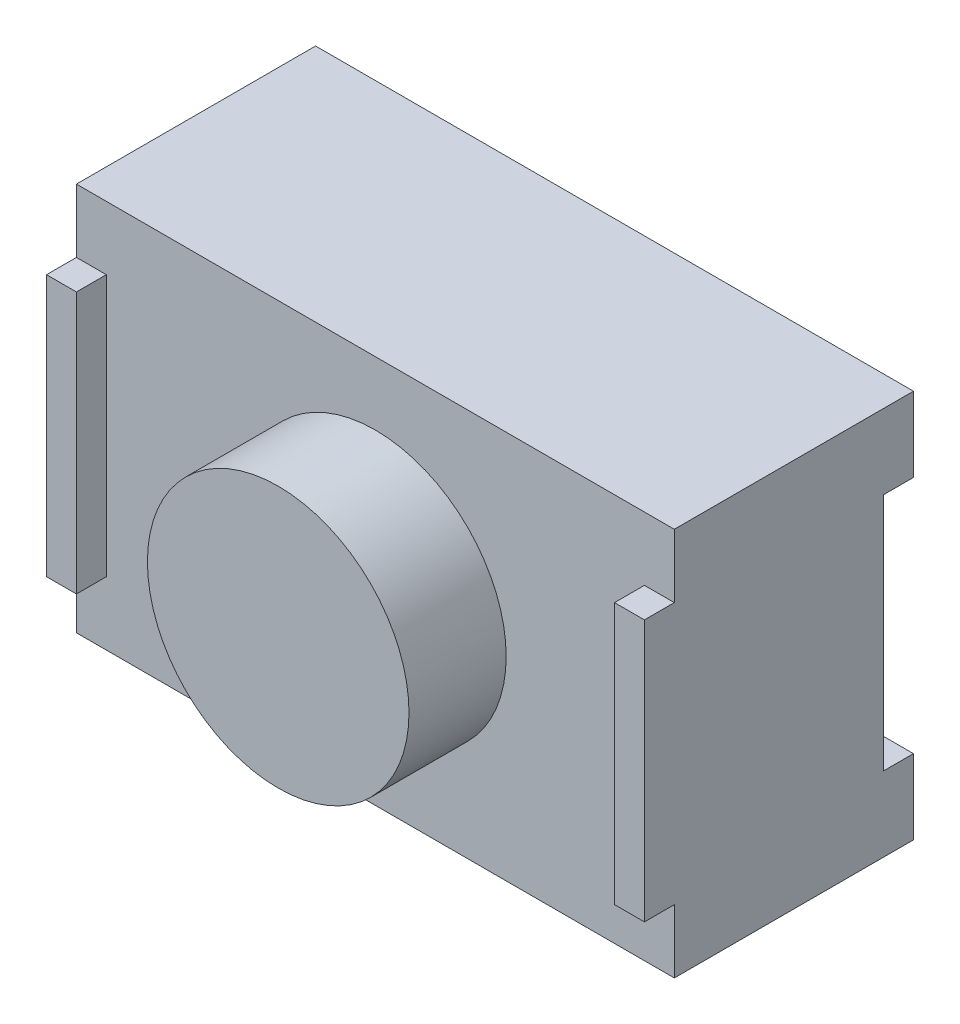
ISO-10303-21;
HEADER;
FILE_DESCRIPTION(('STEP AP214'),'2;1');
FILE_NAME('part.step','',(''),(''),'','','');
FILE_SCHEMA(('AUTOMOTIVE_DESIGN { 1 0 10303 214 1 1 1 1 }'));
ENDSEC;
DATA;
#1=APPLICATION_CONTEXT('core data for automotive mechanical design processes');
#2=APPLICATION_PROTOCOL_DEFINITION('international standard','automotive_design',2000,#1);
#3=PRODUCT_CONTEXT('',#1,'mechanical');
#4=PRODUCT('Part','Part','',(#3));
#5=PRODUCT_RELATED_PRODUCT_CATEGORY('part','',(#4));
#6=PRODUCT_DEFINITION_FORMATION('','',#4);
#7=PRODUCT_DEFINITION_CONTEXT('part definition',#1,'design');
#8=PRODUCT_DEFINITION('design','',#6,#7);
#9=PRODUCT_DEFINITION_SHAPE('','',#8);
#10=(LENGTH_UNIT() NAMED_UNIT(*) SI_UNIT(.MILLI.,.METRE.));
#11=(NAMED_UNIT(*) PLANE_ANGLE_UNIT() SI_UNIT($,.RADIAN.));
#12=(NAMED_UNIT(*) SI_UNIT($,.STERADIAN.) SOLID_ANGLE_UNIT());
#13=UNCERTAINTY_MEASURE_WITH_UNIT(LENGTH_MEASURE(1.E-05),#10,'distance_accuracy_value','');
#14=(GEOMETRIC_REPRESENTATION_CONTEXT(3) GLOBAL_UNCERTAINTY_ASSIGNED_CONTEXT((#13)) GLOBAL_UNIT_ASSIGNED_CONTEXT((#10,
#11,#12)) REPRESENTATION_CONTEXT('',''));
#15=CARTESIAN_POINT('',(0.,0.,0.));
#16=DIRECTION('',(0.,0.,1.));
#17=DIRECTION('',(1.,0.,0.));
#18=AXIS2_PLACEMENT_3D('',#15,#16,#17);
#19=CARTESIAN_POINT('',(0.,0.,0.2));
#20=DIRECTION('',(0.,0.,1.));
#21=DIRECTION('',(1.,0.,0.));
#22=AXIS2_PLACEMENT_3D('',#19,#20,#21);
#23=PLANE('',#22);
#24=DIRECTION('',(1.,0.,0.));
#25=VECTOR('',#24,1.);
#26=CARTESIAN_POINT('',(-2.,0.8,0.2));
#27=LINE('',#26,#25);
#28=CARTESIAN_POINT('',(-2.,0.8,0.2));
#29=VERTEX_POINT('',#28);
#30=CARTESIAN_POINT('',(2.,0.8,0.2));
#31=VERTEX_POINT('',#30);
#32=EDGE_CURVE('E127',#29,#31,#27,.T.);
#33=ORIENTED_EDGE('',*,*,#32,.T.);
#34=DIRECTION('',(0.,1.,0.));
#35=VECTOR('',#34,1.);
#36=CARTESIAN_POINT('',(2.,0.,0.2));
#37=LINE('',#36,#35);
#38=CARTESIAN_POINT('',(2.,-0.8,0.2));
#39=VERTEX_POINT('',#38);
#40=EDGE_CURVE('E184',#39,#31,#37,.T.);
#41=ORIENTED_EDGE('',*,*,#40,.F.);
#42=DIRECTION('',(1.,0.,0.));
#43=VECTOR('',#42,1.);
#44=CARTESIAN_POINT('',(2.,-0.8,0.2));
#45=LINE('',#44,#43);
#46=CARTESIAN_POINT('',(-2.,-0.8,0.2));
#47=VERTEX_POINT('',#46);
#48=EDGE_CURVE('E160',#39,#47,#45,.F.);
#49=ORIENTED_EDGE('',*,*,#48,.T.);
#50=DIRECTION('',(0.,1.,0.));
#51=VECTOR('',#50,1.);
#52=CARTESIAN_POINT('',(-2.,0.,0.2));
#53=LINE('',#52,#51);
#54=EDGE_CURVE('E178',#29,#47,#53,.F.);
#55=ORIENTED_EDGE('',*,*,#54,.F.);
#56=EDGE_LOOP('',(#33,#41,#49,#55));
#57=FACE_BOUND('',#56,.T.);
#58=ADVANCED_FACE('F17',(#57),#23,.F.);
#59=CARTESIAN_POINT('',(-2.,0.8,0.));
#60=DIRECTION('',(0.,1.,0.));
#61=DIRECTION('',(0.,0.,1.));
#62=AXIS2_PLACEMENT_3D('',#59,#60,#61);
#63=PLANE('',#62);
#64=DIRECTION('',(0.,0.,-1.));
#65=VECTOR('',#64,1.);
#66=CARTESIAN_POINT('',(2.,0.8,0.880681818182));
#67=LINE('',#66,#65);
#68=CARTESIAN_POINT('',(2.,0.8,0.));
#69=VERTEX_POINT('',#68);
#70=EDGE_CURVE('E191',#31,#69,#67,.T.);
#71=ORIENTED_EDGE('',*,*,#70,.F.);
#72=ORIENTED_EDGE('',*,*,#32,.F.);
#73=DIRECTION('',(0.,0.,1.));
#74=VECTOR('',#73,1.);
#75=CARTESIAN_POINT('',(-2.,0.8,0.880681818182));
#76=LINE('',#75,#74);
#77=CARTESIAN_POINT('',(-2.,0.8,0.));
#78=VERTEX_POINT('',#77);
#79=EDGE_CURVE('E144',#78,#29,#76,.T.);
#80=ORIENTED_EDGE('',*,*,#79,.F.);
#81=DIRECTION('',(1.,0.,0.));
#82=VECTOR('',#81,1.);
#83=CARTESIAN_POINT('',(0.,0.8,0.));
#84=LINE('',#83,#82);
#85=EDGE_CURVE('E199',#78,#69,#84,.T.);
#86=ORIENTED_EDGE('',*,*,#85,.T.);
#87=EDGE_LOOP('',(#71,#72,#80,#86));
#88=FACE_BOUND('',#87,.T.);
#89=ADVANCED_FACE('F197',(#88),#63,.F.);
#90=CARTESIAN_POINT('',(-2.,0.,0.880681818182));
#91=DIRECTION('',(-1.,0.,0.));
#92=DIRECTION('',(0.,0.,1.));
#93=AXIS2_PLACEMENT_3D('',#90,#91,#92);
#94=PLANE('',#93);
#95=DIRECTION('',(0.,0.,1.));
#96=VECTOR('',#95,1.);
#97=CARTESIAN_POINT('',(-2.,0.875,0.880681818182));
#98=LINE('',#97,#96);
#99=CARTESIAN_POINT('',(-2.,0.875,1.8));
#100=VERTEX_POINT('',#99);
#101=CARTESIAN_POINT('',(-2.,0.875,1.6));
#102=VERTEX_POINT('',#101);
#103=EDGE_CURVE('E159',#100,#102,#98,.F.);
#104=ORIENTED_EDGE('',*,*,#103,.T.);
#105=DIRECTION('',(0.,1.,0.));
#106=VECTOR('',#105,1.);
#107=CARTESIAN_POINT('',(-2.,0.,1.6));
#108=LINE('',#107,#106);
#109=CARTESIAN_POINT('',(-2.,1.3,1.6));
#110=VERTEX_POINT('',#109);
#111=EDGE_CURVE('E150',#102,#110,#108,.T.);
#112=ORIENTED_EDGE('',*,*,#111,.T.);
#113=DIRECTION('',(0.,0.,1.));
#114=VECTOR('',#113,1.);
#115=CARTESIAN_POINT('',(-2.,1.3,0.880681818182));
#116=LINE('',#115,#114);
#117=CARTESIAN_POINT('',(-2.,1.3,0.));
#118=VERTEX_POINT('',#117);
#119=EDGE_CURVE('E133',#110,#118,#116,.F.);
#120=ORIENTED_EDGE('',*,*,#119,.T.);
#121=DIRECTION('',(0.,1.,0.));
#122=VECTOR('',#121,1.);
#123=CARTESIAN_POINT('',(-2.,0.,0.));
#124=LINE('',#123,#122);
#125=EDGE_CURVE('E230',#118,#78,#124,.F.);
#126=ORIENTED_EDGE('',*,*,#125,.T.);
#127=ORIENTED_EDGE('',*,*,#79,.T.);
#128=ORIENTED_EDGE('',*,*,#54,.T.);
#129=DIRECTION('',(0.,0.,-1.));
#130=VECTOR('',#129,1.);
#131=CARTESIAN_POINT('',(-2.,-0.8,0.));
#132=LINE('',#131,#130);
#133=CARTESIAN_POINT('',(-2.,-0.8,0.));
#134=VERTEX_POINT('',#133);
#135=EDGE_CURVE('E162',#47,#134,#132,.T.);
#136=ORIENTED_EDGE('',*,*,#135,.T.);
#137=DIRECTION('',(0.,1.,0.));
#138=VECTOR('',#137,1.);
#139=CARTESIAN_POINT('',(-2.,0.,0.));
#140=LINE('',#139,#138);
#141=CARTESIAN_POINT('',(-2.,-1.3,0.));
#142=VERTEX_POINT('',#141);
#143=EDGE_CURVE('E175',#134,#142,#140,.F.);
#144=ORIENTED_EDGE('',*,*,#143,.T.);
#145=DIRECTION('',(0.,0.,1.));
#146=VECTOR('',#145,1.);
#147=CARTESIAN_POINT('',(-2.,-1.3,0.880681818182));
#148=LINE('',#147,#146);
#149=CARTESIAN_POINT('',(-2.,-1.3,1.6));
#150=VERTEX_POINT('',#149);
#151=EDGE_CURVE('E172',#142,#150,#148,.T.);
#152=ORIENTED_EDGE('',*,*,#151,.T.);
#153=DIRECTION('',(0.,1.,0.));
#154=VECTOR('',#153,1.);
#155=CARTESIAN_POINT('',(-2.,0.,1.6));
#156=LINE('',#155,#154);
#157=CARTESIAN_POINT('',(-2.,-0.875,1.6));
#158=VERTEX_POINT('',#157);
#159=EDGE_CURVE('E169',#150,#158,#156,.T.);
#160=ORIENTED_EDGE('',*,*,#159,.T.);
#161=DIRECTION('',(0.,0.,1.));
#162=VECTOR('',#161,1.);
#163=CARTESIAN_POINT('',(-2.,-0.875,0.880681818182));
#164=LINE('',#163,#162);
#165=CARTESIAN_POINT('',(-2.,-0.875,1.8));
#166=VERTEX_POINT('',#165);
#167=EDGE_CURVE('E164',#158,#166,#164,.T.);
#168=ORIENTED_EDGE('',*,*,#167,.T.);
#169=DIRECTION('',(0.,1.,0.));
#170=VECTOR('',#169,1.);
#171=CARTESIAN_POINT('',(-2.,0.,1.8));
#172=LINE('',#171,#170);
#173=EDGE_CURVE('E221',#100,#166,#172,.F.);
#174=ORIENTED_EDGE('',*,*,#173,.F.);
#175=EDGE_LOOP('',(#104,#112,#120,#126,#127,#128,#136,#144,#152,#160,#168,#174));
#176=FACE_BOUND('',#175,.T.);
#177=ADVANCED_FACE('F157',(#176),#94,.T.);
#178=CARTESIAN_POINT('',(2.,-0.8,0.));
#179=DIRECTION('',(0.,-1.,0.));
#180=DIRECTION('',(0.,0.,-1.));
#181=AXIS2_PLACEMENT_3D('',#178,#179,#180);
#182=PLANE('',#181);
#183=ORIENTED_EDGE('',*,*,#135,.F.);
#184=ORIENTED_EDGE('',*,*,#48,.F.);
#185=DIRECTION('',(0.,0.,-1.));
#186=VECTOR('',#185,1.);
#187=CARTESIAN_POINT('',(2.,-0.8,0.880681818182));
#188=LINE('',#187,#186);
#189=CARTESIAN_POINT('',(2.,-0.8,0.));
#190=VERTEX_POINT('',#189);
#191=EDGE_CURVE('E194',#190,#39,#188,.F.);
#192=ORIENTED_EDGE('',*,*,#191,.F.);
#193=DIRECTION('',(1.,0.,0.));
#194=VECTOR('',#193,1.);
#195=CARTESIAN_POINT('',(0.,-0.8,0.));
#196=LINE('',#195,#194);
#197=EDGE_CURVE('E212',#190,#134,#196,.F.);
#198=ORIENTED_EDGE('',*,*,#197,.T.);
#199=EDGE_LOOP('',(#183,#184,#192,#198));
#200=FACE_BOUND('',#199,.T.);
#201=ADVANCED_FACE('F213',(#200),#182,.F.);
#202=CARTESIAN_POINT('',(2.,0.,0.880681818182));
#203=DIRECTION('',(1.,0.,0.));
#204=DIRECTION('',(0.,0.,-1.));
#205=AXIS2_PLACEMENT_3D('',#202,#203,#204);
#206=PLANE('',#205);
#207=DIRECTION('',(0.,0.,-1.));
#208=VECTOR('',#207,1.);
#209=CARTESIAN_POINT('',(2.,-0.875,0.880681818182));
#210=LINE('',#209,#208);
#211=CARTESIAN_POINT('',(2.,-0.875,1.8));
#212=VERTEX_POINT('',#211);
#213=CARTESIAN_POINT('',(2.,-0.875,1.6));
#214=VERTEX_POINT('',#213);
#215=EDGE_CURVE('E235',#212,#214,#210,.T.);
#216=ORIENTED_EDGE('',*,*,#215,.T.);
#217=DIRECTION('',(0.,1.,0.));
#218=VECTOR('',#217,1.);
#219=CARTESIAN_POINT('',(2.,0.,1.6));
#220=LINE('',#219,#218);
#221=CARTESIAN_POINT('',(2.,-1.3,1.6));
#222=VERTEX_POINT('',#221);
#223=EDGE_CURVE('E232',#214,#222,#220,.F.);
#224=ORIENTED_EDGE('',*,*,#223,.T.);
#225=DIRECTION('',(0.,0.,-1.));
#226=VECTOR('',#225,1.);
#227=CARTESIAN_POINT('',(2.,-1.3,0.880681818182));
#228=LINE('',#227,#226);
#229=CARTESIAN_POINT('',(2.,-1.3,0.));
#230=VERTEX_POINT('',#229);
#231=EDGE_CURVE('E203',#222,#230,#228,.T.);
#232=ORIENTED_EDGE('',*,*,#231,.T.);
#233=DIRECTION('',(0.,1.,0.));
#234=VECTOR('',#233,1.);
#235=CARTESIAN_POINT('',(2.,0.,0.));
#236=LINE('',#235,#234);
#237=EDGE_CURVE('E216',#230,#190,#236,.T.);
#238=ORIENTED_EDGE('',*,*,#237,.T.);
#239=ORIENTED_EDGE('',*,*,#191,.T.);
#240=ORIENTED_EDGE('',*,*,#40,.T.);
#241=ORIENTED_EDGE('',*,*,#70,.T.);
#242=DIRECTION('',(0.,1.,0.));
#243=VECTOR('',#242,1.);
#244=CARTESIAN_POINT('',(2.,0.,0.));
#245=LINE('',#244,#243);
#246=CARTESIAN_POINT('',(2.,1.3,0.));
#247=VERTEX_POINT('',#246);
#248=EDGE_CURVE('E227',#69,#247,#245,.T.);
#249=ORIENTED_EDGE('',*,*,#248,.T.);
#250=DIRECTION('',(0.,0.,-1.));
#251=VECTOR('',#250,1.);
#252=CARTESIAN_POINT('',(2.,1.3,0.880681818182));
#253=LINE('',#252,#251);
#254=CARTESIAN_POINT('',(2.,1.3,1.6));
#255=VERTEX_POINT('',#254);
#256=EDGE_CURVE('E200',#247,#255,#253,.F.);
#257=ORIENTED_EDGE('',*,*,#256,.T.);
#258=DIRECTION('',(0.,1.,0.));
#259=VECTOR('',#258,1.);
#260=CARTESIAN_POINT('',(2.,0.,1.6));
#261=LINE('',#260,#259);
#262=CARTESIAN_POINT('',(2.,0.875,1.6));
#263=VERTEX_POINT('',#262);
#264=EDGE_CURVE('E153',#255,#263,#261,.F.);
#265=ORIENTED_EDGE('',*,*,#264,.T.);
#266=DIRECTION('',(0.,0.,-1.));
#267=VECTOR('',#266,1.);
#268=CARTESIAN_POINT('',(2.,0.875,0.880681818182));
#269=LINE('',#268,#267);
#270=CARTESIAN_POINT('',(2.,0.875,1.8));
#271=VERTEX_POINT('',#270);
#272=EDGE_CURVE('E237',#263,#271,#269,.F.);
#273=ORIENTED_EDGE('',*,*,#272,.T.);
#274=DIRECTION('',(0.,1.,0.));
#275=VECTOR('',#274,1.);
#276=CARTESIAN_POINT('',(2.,0.,1.8));
#277=LINE('',#276,#275);
#278=EDGE_CURVE('E244',#212,#271,#277,.T.);
#279=ORIENTED_EDGE('',*,*,#278,.F.);
#280=EDGE_LOOP('',(#216,#224,#232,#238,#239,#240,#241,#249,#257,#265,#273,#279));
#281=FACE_BOUND('',#280,.T.);
#282=ADVANCED_FACE('F189',(#281),#206,.T.);
#283=CARTESIAN_POINT('',(0.,0.,0.));
#284=DIRECTION('',(0.,0.,1.));
#285=DIRECTION('',(1.,0.,0.));
#286=AXIS2_PLACEMENT_3D('',#283,#284,#285);
#287=PLANE('',#286);
#288=ORIENTED_EDGE('',*,*,#85,.F.);
#289=ORIENTED_EDGE('',*,*,#125,.F.);
#290=DIRECTION('',(1.,0.,0.));
#291=VECTOR('',#290,1.);
#292=CARTESIAN_POINT('',(2.,1.3,0.));
#293=LINE('',#292,#291);
#294=EDGE_CURVE('E139',#118,#247,#293,.T.);
#295=ORIENTED_EDGE('',*,*,#294,.T.);
#296=ORIENTED_EDGE('',*,*,#248,.F.);
#297=EDGE_LOOP('',(#288,#289,#295,#296));
#298=FACE_BOUND('',#297,.T.);
#299=ADVANCED_FACE('F242',(#298),#287,.F.);
#300=CARTESIAN_POINT('',(0.,0.,1.8));
#301=DIRECTION('',(0.,0.,1.));
#302=DIRECTION('',(1.,0.,0.));
#303=AXIS2_PLACEMENT_3D('',#300,#301,#302);
#304=PLANE('',#303);
#305=DIRECTION('',(0.,1.,0.));
#306=VECTOR('',#305,1.);
#307=CARTESIAN_POINT('',(-1.8,-0.875,1.8));
#308=LINE('',#307,#306);
#309=CARTESIAN_POINT('',(-1.8,-0.875,1.8));
#310=VERTEX_POINT('',#309);
#311=CARTESIAN_POINT('',(-1.8,0.875,1.8));
#312=VERTEX_POINT('',#311);
#313=EDGE_CURVE('E247',#310,#312,#308,.T.);
#314=ORIENTED_EDGE('',*,*,#313,.T.);
#315=DIRECTION('',(1.,0.,0.));
#316=VECTOR('',#315,1.);
#317=CARTESIAN_POINT('',(-1.8,0.875,1.8));
#318=LINE('',#317,#316);
#319=EDGE_CURVE('E243',#312,#100,#318,.F.);
#320=ORIENTED_EDGE('',*,*,#319,.T.);
#321=ORIENTED_EDGE('',*,*,#173,.T.);
#322=DIRECTION('',(1.,0.,0.));
#323=VECTOR('',#322,1.);
#324=CARTESIAN_POINT('',(0.,-0.875,1.8));
#325=LINE('',#324,#323);
#326=EDGE_CURVE('E217',#166,#310,#325,.T.);
#327=ORIENTED_EDGE('',*,*,#326,.T.);
#328=EDGE_LOOP('',(#314,#320,#321,#327));
#329=FACE_BOUND('',#328,.T.);
#330=ADVANCED_FACE('F279',(#329),#304,.T.);
#331=CARTESIAN_POINT('',(0.,0.,0.));
#332=DIRECTION('',(0.,0.,1.));
#333=DIRECTION('',(1.,0.,0.));
#334=AXIS2_PLACEMENT_3D('',#331,#332,#333);
#335=PLANE('',#334);
#336=DIRECTION('',(1.,0.,0.));
#337=VECTOR('',#336,1.);
#338=CARTESIAN_POINT('',(-2.,-1.3,0.));
#339=LINE('',#338,#337);
#340=EDGE_CURVE('E270',#230,#142,#339,.F.);
#341=ORIENTED_EDGE('',*,*,#340,.T.);
#342=ORIENTED_EDGE('',*,*,#143,.F.);
#343=ORIENTED_EDGE('',*,*,#197,.F.);
#344=ORIENTED_EDGE('',*,*,#237,.F.);
#345=EDGE_LOOP('',(#341,#342,#343,#344));
#346=FACE_BOUND('',#345,.T.);
#347=ADVANCED_FACE('F310',(#346),#335,.F.);
#348=CARTESIAN_POINT('',(0.,0.,1.8));
#349=DIRECTION('',(0.,0.,1.));
#350=DIRECTION('',(1.,0.,0.));
#351=AXIS2_PLACEMENT_3D('',#348,#349,#350);
#352=PLANE('',#351);
#353=DIRECTION('',(1.,0.,0.));
#354=VECTOR('',#353,1.);
#355=CARTESIAN_POINT('',(1.8,-0.875,1.8));
#356=LINE('',#355,#354);
#357=CARTESIAN_POINT('',(1.8,-0.875,1.8));
#358=VERTEX_POINT('',#357);
#359=EDGE_CURVE('E260',#358,#212,#356,.T.);
#360=ORIENTED_EDGE('',*,*,#359,.T.);
#361=ORIENTED_EDGE('',*,*,#278,.T.);
#362=DIRECTION('',(1.,0.,0.));
#363=VECTOR('',#362,1.);
#364=CARTESIAN_POINT('',(0.,0.875,1.8));
#365=LINE('',#364,#363);
#366=CARTESIAN_POINT('',(1.8,0.875,1.8));
#367=VERTEX_POINT('',#366);
#368=EDGE_CURVE('E219',#271,#367,#365,.F.);
#369=ORIENTED_EDGE('',*,*,#368,.T.);
#370=DIRECTION('',(0.,1.,0.));
#371=VECTOR('',#370,1.);
#372=CARTESIAN_POINT('',(1.8,0.875,1.8));
#373=LINE('',#372,#371);
#374=EDGE_CURVE('E254',#367,#358,#373,.F.);
#375=ORIENTED_EDGE('',*,*,#374,.T.);
#376=EDGE_LOOP('',(#360,#361,#369,#375));
#377=FACE_BOUND('',#376,.T.);
#378=ADVANCED_FACE('F253',(#377),#352,.T.);
#379=CARTESIAN_POINT('',(0.,0.,2.25));
#380=DIRECTION('',(0.,0.,1.));
#381=DIRECTION('',(1.,0.,0.));
#382=AXIS2_PLACEMENT_3D('',#379,#380,#381);
#383=PLANE('',#382);
#384=CARTESIAN_POINT('',(0.,0.,2.25));
#385=DIRECTION('',(0.,0.,1.));
#386=DIRECTION('',(1.,0.,0.));
#387=AXIS2_PLACEMENT_3D('',#384,#385,#386);
#388=CIRCLE('',#387,0.875);
#389=CARTESIAN_POINT('',(0.875,0.,2.25));
#390=VERTEX_POINT('',#389);
#391=EDGE_CURVE('E20',#390,#390,#388,.F.);
#392=ORIENTED_EDGE('',*,*,#391,.F.);
#393=EDGE_LOOP('',(#392));
#394=FACE_BOUND('',#393,.T.);
#395=ADVANCED_FACE('F401',(#394),#383,.T.);
#396=CARTESIAN_POINT('',(2.,1.3,0.));
#397=DIRECTION('',(0.,-1.,0.));
#398=DIRECTION('',(0.,0.,-1.));
#399=AXIS2_PLACEMENT_3D('',#396,#397,#398);
#400=PLANE('',#399);
#401=DIRECTION('',(1.,0.,0.));
#402=VECTOR('',#401,1.);
#403=CARTESIAN_POINT('',(0.,1.3,1.6));
#404=LINE('',#403,#402);
#405=EDGE_CURVE('E136',#255,#110,#404,.F.);
#406=ORIENTED_EDGE('',*,*,#405,.F.);
#407=ORIENTED_EDGE('',*,*,#256,.F.);
#408=ORIENTED_EDGE('',*,*,#294,.F.);
#409=ORIENTED_EDGE('',*,*,#119,.F.);
#410=EDGE_LOOP('',(#406,#407,#408,#409));
#411=FACE_BOUND('',#410,.T.);
#412=ADVANCED_FACE('F135',(#411),#400,.F.);
#413=CARTESIAN_POINT('',(-1.8,0.875,1.6));
#414=DIRECTION('',(0.,-1.,0.));
#415=DIRECTION('',(0.,0.,-1.));
#416=AXIS2_PLACEMENT_3D('',#413,#414,#415);
#417=PLANE('',#416);
#418=ORIENTED_EDGE('',*,*,#103,.F.);
#419=ORIENTED_EDGE('',*,*,#319,.F.);
#420=DIRECTION('',(0.,0.,1.));
#421=VECTOR('',#420,1.);
#422=CARTESIAN_POINT('',(-1.8,0.875,1.6));
#423=LINE('',#422,#421);
#424=CARTESIAN_POINT('',(-1.8,0.875,1.6));
#425=VERTEX_POINT('',#424);
#426=EDGE_CURVE('E275',#312,#425,#423,.F.);
#427=ORIENTED_EDGE('',*,*,#426,.T.);
#428=DIRECTION('',(1.,0.,0.));
#429=VECTOR('',#428,1.);
#430=CARTESIAN_POINT('',(0.,0.875,1.6));
#431=LINE('',#430,#429);
#432=EDGE_CURVE('E154',#102,#425,#431,.T.);
#433=ORIENTED_EDGE('',*,*,#432,.F.);
#434=EDGE_LOOP('',(#418,#419,#427,#433));
#435=FACE_BOUND('',#434,.T.);
#436=ADVANCED_FACE('F285',(#435),#417,.F.);
#437=CARTESIAN_POINT('',(-1.8,-0.875,1.6));
#438=DIRECTION('',(-1.,0.,0.));
#439=DIRECTION('',(0.,0.,1.));
#440=AXIS2_PLACEMENT_3D('',#437,#438,#439);
#441=PLANE('',#440);
#442=ORIENTED_EDGE('',*,*,#426,.F.);
#443=ORIENTED_EDGE('',*,*,#313,.F.);
#444=DIRECTION('',(0.,0.,1.));
#445=VECTOR('',#444,1.);
#446=CARTESIAN_POINT('',(-1.8,-0.875,1.6));
#447=LINE('',#446,#445);
#448=CARTESIAN_POINT('',(-1.8,-0.875,1.6));
#449=VERTEX_POINT('',#448);
#450=EDGE_CURVE('E273',#310,#449,#447,.F.);
#451=ORIENTED_EDGE('',*,*,#450,.T.);
#452=DIRECTION('',(0.,1.,0.));
#453=VECTOR('',#452,1.);
#454=CARTESIAN_POINT('',(-1.8,0.,1.6));
#455=LINE('',#454,#453);
#456=EDGE_CURVE('E289',#425,#449,#455,.F.);
#457=ORIENTED_EDGE('',*,*,#456,.F.);
#458=EDGE_LOOP('',(#442,#443,#451,#457));
#459=FACE_BOUND('',#458,.T.);
#460=ADVANCED_FACE('F287',(#459),#441,.F.);
#461=CARTESIAN_POINT('',(-2.,-0.875,1.6));
#462=DIRECTION('',(0.,1.,0.));
#463=DIRECTION('',(0.,0.,1.));
#464=AXIS2_PLACEMENT_3D('',#461,#462,#463);
#465=PLANE('',#464);
#466=ORIENTED_EDGE('',*,*,#450,.F.);
#467=ORIENTED_EDGE('',*,*,#326,.F.);
#468=ORIENTED_EDGE('',*,*,#167,.F.);
#469=DIRECTION('',(1.,0.,0.));
#470=VECTOR('',#469,1.);
#471=CARTESIAN_POINT('',(0.,-0.875,1.6));
#472=LINE('',#471,#470);
#473=EDGE_CURVE('E292',#449,#158,#472,.F.);
#474=ORIENTED_EDGE('',*,*,#473,.F.);
#475=EDGE_LOOP('',(#466,#467,#468,#474));
#476=FACE_BOUND('',#475,.T.);
#477=ADVANCED_FACE('F313',(#476),#465,.F.);
#478=CARTESIAN_POINT('',(-2.,-1.3,0.));
#479=DIRECTION('',(0.,1.,0.));
#480=DIRECTION('',(0.,0.,1.));
#481=AXIS2_PLACEMENT_3D('',#478,#479,#480);
#482=PLANE('',#481);
#483=DIRECTION('',(1.,0.,0.));
#484=VECTOR('',#483,1.);
#485=CARTESIAN_POINT('',(0.,-1.3,1.6));
#486=LINE('',#485,#484);
#487=EDGE_CURVE('E296',#150,#222,#486,.T.);
#488=ORIENTED_EDGE('',*,*,#487,.F.);
#489=ORIENTED_EDGE('',*,*,#151,.F.);
#490=ORIENTED_EDGE('',*,*,#340,.F.);
#491=ORIENTED_EDGE('',*,*,#231,.F.);
#492=EDGE_LOOP('',(#488,#489,#490,#491));
#493=FACE_BOUND('',#492,.T.);
#494=ADVANCED_FACE('F311',(#493),#482,.F.);
#495=CARTESIAN_POINT('',(1.8,-0.875,1.6));
#496=DIRECTION('',(0.,1.,0.));
#497=DIRECTION('',(0.,0.,1.));
#498=AXIS2_PLACEMENT_3D('',#495,#496,#497);
#499=PLANE('',#498);
#500=ORIENTED_EDGE('',*,*,#215,.F.);
#501=ORIENTED_EDGE('',*,*,#359,.F.);
#502=DIRECTION('',(0.,0.,-1.));
#503=VECTOR('',#502,1.);
#504=CARTESIAN_POINT('',(1.8,-0.875,1.6));
#505=LINE('',#504,#503);
#506=CARTESIAN_POINT('',(1.8,-0.875,1.6));
#507=VERTEX_POINT('',#506);
#508=EDGE_CURVE('E259',#358,#507,#505,.T.);
#509=ORIENTED_EDGE('',*,*,#508,.T.);
#510=DIRECTION('',(1.,0.,0.));
#511=VECTOR('',#510,1.);
#512=CARTESIAN_POINT('',(0.,-0.875,1.6));
#513=LINE('',#512,#511);
#514=EDGE_CURVE('E299',#214,#507,#513,.F.);
#515=ORIENTED_EDGE('',*,*,#514,.F.);
#516=EDGE_LOOP('',(#500,#501,#509,#515));
#517=FACE_BOUND('',#516,.T.);
#518=ADVANCED_FACE('F306',(#517),#499,.F.);
#519=CARTESIAN_POINT('',(1.8,0.875,1.6));
#520=DIRECTION('',(1.,0.,0.));
#521=DIRECTION('',(0.,0.,-1.));
#522=AXIS2_PLACEMENT_3D('',#519,#520,#521);
#523=PLANE('',#522);
#524=ORIENTED_EDGE('',*,*,#508,.F.);
#525=ORIENTED_EDGE('',*,*,#374,.F.);
#526=DIRECTION('',(0.,0.,-1.));
#527=VECTOR('',#526,1.);
#528=CARTESIAN_POINT('',(1.8,0.875,1.6));
#529=LINE('',#528,#527);
#530=CARTESIAN_POINT('',(1.8,0.875,1.6));
#531=VERTEX_POINT('',#530);
#532=EDGE_CURVE('E34',#367,#531,#529,.T.);
#533=ORIENTED_EDGE('',*,*,#532,.T.);
#534=DIRECTION('',(0.,1.,0.));
#535=VECTOR('',#534,1.);
#536=CARTESIAN_POINT('',(1.8,0.,1.6));
#537=LINE('',#536,#535);
#538=EDGE_CURVE('E302',#507,#531,#537,.T.);
#539=ORIENTED_EDGE('',*,*,#538,.F.);
#540=EDGE_LOOP('',(#524,#525,#533,#539));
#541=FACE_BOUND('',#540,.T.);
#542=ADVANCED_FACE('F258',(#541),#523,.F.);
#543=CARTESIAN_POINT('',(2.,0.875,1.6));
#544=DIRECTION('',(0.,-1.,0.));
#545=DIRECTION('',(0.,0.,-1.));
#546=AXIS2_PLACEMENT_3D('',#543,#544,#545);
#547=PLANE('',#546);
#548=ORIENTED_EDGE('',*,*,#532,.F.);
#549=ORIENTED_EDGE('',*,*,#368,.F.);
#550=ORIENTED_EDGE('',*,*,#272,.F.);
#551=DIRECTION('',(1.,0.,0.));
#552=VECTOR('',#551,1.);
#553=CARTESIAN_POINT('',(0.,0.875,1.6));
#554=LINE('',#553,#552);
#555=EDGE_CURVE('E26',#531,#263,#554,.T.);
#556=ORIENTED_EDGE('',*,*,#555,.F.);
#557=EDGE_LOOP('',(#548,#549,#550,#556));
#558=FACE_BOUND('',#557,.T.);
#559=ADVANCED_FACE('F262',(#558),#547,.F.);
#560=CARTESIAN_POINT('',(0.,0.,2.25));
#561=DIRECTION('',(0.,0.,1.));
#562=DIRECTION('',(1.,0.,0.));
#563=AXIS2_PLACEMENT_3D('',#560,#561,#562);
#564=CYLINDRICAL_SURFACE('',#563,0.875);
#565=CARTESIAN_POINT('',(0.,0.,1.6));
#566=DIRECTION('',(0.,0.,1.));
#567=DIRECTION('',(1.,0.,0.));
#568=AXIS2_PLACEMENT_3D('',#565,#566,#567);
#569=CIRCLE('',#568,0.875);
#570=CARTESIAN_POINT('',(0.875,0.,1.6));
#571=VERTEX_POINT('',#570);
#572=EDGE_CURVE('E11',#571,#571,#569,.F.);
#573=ORIENTED_EDGE('',*,*,#572,.F.);
#574=EDGE_LOOP('',(#573));
#575=FACE_BOUND('',#574,.T.);
#576=ORIENTED_EDGE('',*,*,#391,.T.);
#577=EDGE_LOOP('',(#576));
#578=FACE_BOUND('',#577,.T.);
#579=ADVANCED_FACE('F324',(#575,#578),#564,.T.);
#580=CARTESIAN_POINT('',(0.,0.,1.6));
#581=DIRECTION('',(0.,0.,1.));
#582=DIRECTION('',(1.,0.,0.));
#583=AXIS2_PLACEMENT_3D('',#580,#581,#582);
#584=PLANE('',#583);
#585=ORIENTED_EDGE('',*,*,#572,.T.);
#586=EDGE_LOOP('',(#585));
#587=FACE_BOUND('',#586,.T.);
#588=ORIENTED_EDGE('',*,*,#555,.T.);
#589=ORIENTED_EDGE('',*,*,#264,.F.);
#590=ORIENTED_EDGE('',*,*,#405,.T.);
#591=ORIENTED_EDGE('',*,*,#111,.F.);
#592=ORIENTED_EDGE('',*,*,#432,.T.);
#593=ORIENTED_EDGE('',*,*,#456,.T.);
#594=ORIENTED_EDGE('',*,*,#473,.T.);
#595=ORIENTED_EDGE('',*,*,#159,.F.);
#596=ORIENTED_EDGE('',*,*,#487,.T.);
#597=ORIENTED_EDGE('',*,*,#223,.F.);
#598=ORIENTED_EDGE('',*,*,#514,.T.);
#599=ORIENTED_EDGE('',*,*,#538,.T.);
#600=EDGE_LOOP('',(#588,#589,#590,#591,#592,#593,#594,#595,#596,#597,#598,#599));
#601=FACE_BOUND('',#600,.T.);
#602=ADVANCED_FACE('F148',(#587,#601),#584,.T.);
#603=CLOSED_SHELL('',(#58,#89,#177,#201,#282,#299,#330,#347,#378,#395,#412,#436,#460,#477,#494,
#518,#542,#559,#579,#602));
#604=MANIFOLD_SOLID_BREP('B1',#603);
#605=ADVANCED_BREP_SHAPE_REPRESENTATION('',(#18,#604),#14);
#606=SHAPE_DEFINITION_REPRESENTATION(#9,#605);
ENDSEC;
END-ISO-10303-21;
